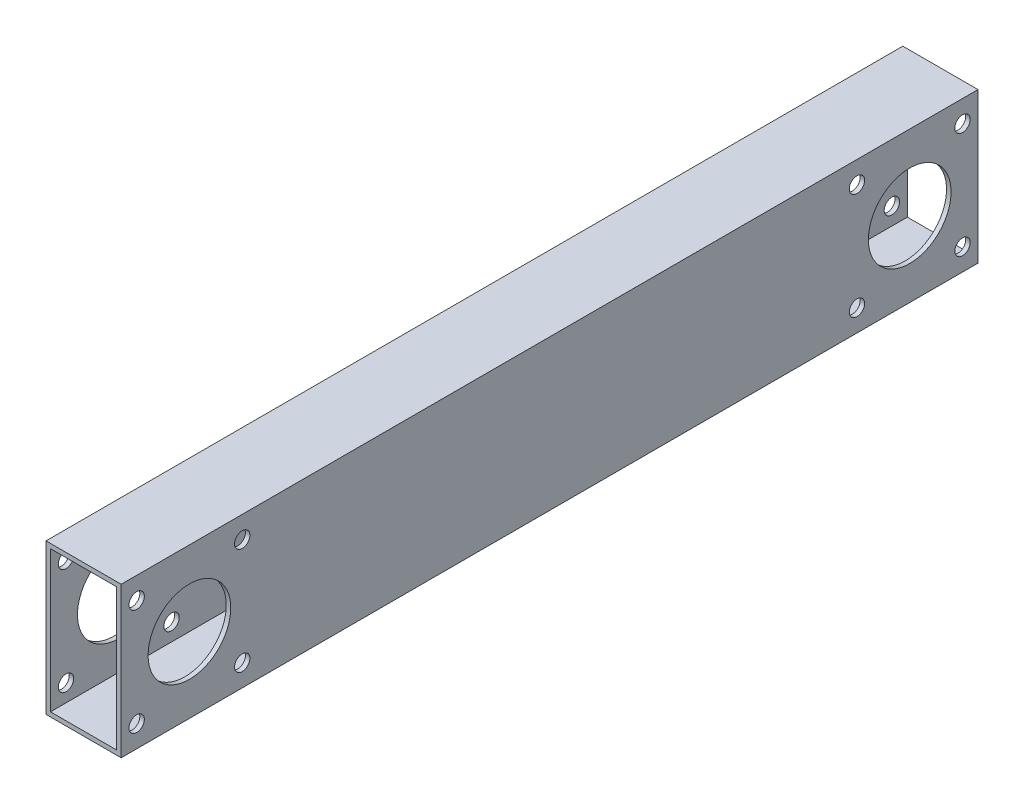
ISO-10303-21;
HEADER;
FILE_DESCRIPTION(('STEP AP214'),'2;1');
FILE_NAME('part.step','',(''),(''),'','','');
FILE_SCHEMA(('AUTOMOTIVE_DESIGN { 1 0 10303 214 1 1 1 1 }'));
ENDSEC;
DATA;
#1=APPLICATION_CONTEXT('core data for automotive mechanical design processes');
#2=APPLICATION_PROTOCOL_DEFINITION('international standard','automotive_design',2000,#1);
#3=PRODUCT_CONTEXT('',#1,'mechanical');
#4=PRODUCT('Part','Part','',(#3));
#5=PRODUCT_RELATED_PRODUCT_CATEGORY('part','',(#4));
#6=PRODUCT_DEFINITION_FORMATION('','',#4);
#7=PRODUCT_DEFINITION_CONTEXT('part definition',#1,'design');
#8=PRODUCT_DEFINITION('design','',#6,#7);
#9=PRODUCT_DEFINITION_SHAPE('','',#8);
#10=(LENGTH_UNIT() NAMED_UNIT(*) SI_UNIT(.MILLI.,.METRE.));
#11=(NAMED_UNIT(*) PLANE_ANGLE_UNIT() SI_UNIT($,.RADIAN.));
#12=(NAMED_UNIT(*) SI_UNIT($,.STERADIAN.) SOLID_ANGLE_UNIT());
#13=UNCERTAINTY_MEASURE_WITH_UNIT(LENGTH_MEASURE(1.E-05),#10,'distance_accuracy_value','');
#14=(GEOMETRIC_REPRESENTATION_CONTEXT(3) GLOBAL_UNCERTAINTY_ASSIGNED_CONTEXT((#13)) GLOBAL_UNIT_ASSIGNED_CONTEXT((#10,
#11,#12)) REPRESENTATION_CONTEXT('',''));
#15=CARTESIAN_POINT('',(0.,0.,0.));
#16=DIRECTION('',(0.,0.,1.));
#17=DIRECTION('',(1.,0.,0.));
#18=AXIS2_PLACEMENT_3D('',#15,#16,#17);
#19=CARTESIAN_POINT('',(0.,100.,570.));
#20=DIRECTION('',(1.,0.,0.));
#21=DIRECTION('',(0.,0.,-1.));
#22=AXIS2_PLACEMENT_3D('',#19,#20,#21);
#23=PLANE('',#22);
#24=CARTESIAN_POINT('',(0.,14.5403167728691,10.2991744768466));
#25=DIRECTION('',(-1.,0.,0.));
#26=DIRECTION('',(0.,0.,1.));
#27=AXIS2_PLACEMENT_3D('',#24,#25,#26);
#28=CIRCLE('',#27,5.1152124263048);
#29=CARTESIAN_POINT('',(0.,14.5403167728691,15.4143869031514));
#30=VERTEX_POINT('',#29);
#31=EDGE_CURVE('E278',#30,#30,#28,.F.);
#32=ORIENTED_EDGE('',*,*,#31,.T.);
#33=EDGE_LOOP('',(#32));
#34=FACE_BOUND('',#33,.T.);
#35=CARTESIAN_POINT('',(0.,85.4596832271309,489.472116890751));
#36=DIRECTION('',(-1.,0.,0.));
#37=DIRECTION('',(0.,0.,1.));
#38=AXIS2_PLACEMENT_3D('',#35,#36,#37);
#39=CIRCLE('',#38,5.1152124263048);
#40=CARTESIAN_POINT('',(0.,85.4596832271309,494.587329317055));
#41=VERTEX_POINT('',#40);
#42=EDGE_CURVE('E282',#41,#41,#39,.T.);
#43=ORIENTED_EDGE('',*,*,#42,.F.);
#44=EDGE_LOOP('',(#43));
#45=FACE_BOUND('',#44,.T.);
#46=CARTESIAN_POINT('',(0.,14.5403167728691,489.472116890751));
#47=DIRECTION('',(-1.,0.,0.));
#48=DIRECTION('',(0.,0.,1.));
#49=AXIS2_PLACEMENT_3D('',#46,#47,#48);
#50=CIRCLE('',#49,5.1152124263048);
#51=CARTESIAN_POINT('',(0.,14.5403167728691,494.587329317055));
#52=VERTEX_POINT('',#51);
#53=EDGE_CURVE('E286',#52,#52,#50,.F.);
#54=ORIENTED_EDGE('',*,*,#53,.T.);
#55=EDGE_LOOP('',(#54));
#56=FACE_BOUND('',#55,.T.);
#57=CARTESIAN_POINT('',(0.,85.4596832271309,10.2991744768466));
#58=DIRECTION('',(-1.,0.,0.));
#59=DIRECTION('',(0.,0.,1.));
#60=AXIS2_PLACEMENT_3D('',#57,#58,#59);
#61=CIRCLE('',#60,5.1152124263048);
#62=CARTESIAN_POINT('',(0.,85.4596832271309,15.4143869031514));
#63=VERTEX_POINT('',#62);
#64=EDGE_CURVE('E290',#63,#63,#61,.T.);
#65=ORIENTED_EDGE('',*,*,#64,.F.);
#66=EDGE_LOOP('',(#65));
#67=FACE_BOUND('',#66,.T.);
#68=CARTESIAN_POINT('',(0.,85.4596832271309,80.5278831092492));
#69=DIRECTION('',(-1.,0.,0.));
#70=DIRECTION('',(0.,0.,1.));
#71=AXIS2_PLACEMENT_3D('',#68,#69,#70);
#72=CIRCLE('',#71,5.1152124263048);
#73=CARTESIAN_POINT('',(0.,85.4596832271309,85.6430955355541));
#74=VERTEX_POINT('',#73);
#75=EDGE_CURVE('E182',#74,#74,#72,.F.);
#76=ORIENTED_EDGE('',*,*,#75,.T.);
#77=EDGE_LOOP('',(#76));
#78=FACE_BOUND('',#77,.T.);
#79=CARTESIAN_POINT('',(0.,50.,45.4135287930479));
#80=DIRECTION('',(-1.,0.,0.));
#81=DIRECTION('',(0.,0.,1.));
#82=AXIS2_PLACEMENT_3D('',#79,#80,#81);
#83=CIRCLE('',#82,27.5);
#84=CARTESIAN_POINT('',(0.,50.,72.9135287930479));
#85=VERTEX_POINT('',#84);
#86=EDGE_CURVE('E172',#85,#85,#83,.T.);
#87=ORIENTED_EDGE('',*,*,#86,.F.);
#88=EDGE_LOOP('',(#87));
#89=FACE_BOUND('',#88,.T.);
#90=CARTESIAN_POINT('',(0.,50.,524.586471206952));
#91=DIRECTION('',(-1.,0.,0.));
#92=DIRECTION('',(0.,0.,-1.));
#93=AXIS2_PLACEMENT_3D('',#90,#91,#92);
#94=CIRCLE('',#93,27.5);
#95=CARTESIAN_POINT('',(0.,50.,497.086471206952));
#96=VERTEX_POINT('',#95);
#97=EDGE_CURVE('E232',#96,#96,#94,.T.);
#98=ORIENTED_EDGE('',*,*,#97,.F.);
#99=EDGE_LOOP('',(#98));
#100=FACE_BOUND('',#99,.T.);
#101=DIRECTION('',(0.,-1.,0.));
#102=VECTOR('',#101,1.);
#103=CARTESIAN_POINT('',(0.,100.,0.));
#104=LINE('',#103,#102);
#105=CARTESIAN_POINT('',(0.,100.,0.));
#106=VERTEX_POINT('',#105);
#107=CARTESIAN_POINT('',(0.,0.,0.));
#108=VERTEX_POINT('',#107);
#109=EDGE_CURVE('E120',#106,#108,#104,.T.);
#110=ORIENTED_EDGE('',*,*,#109,.T.);
#111=DIRECTION('',(0.,0.,-1.));
#112=VECTOR('',#111,1.);
#113=CARTESIAN_POINT('',(0.,0.,570.));
#114=LINE('',#113,#112);
#115=CARTESIAN_POINT('',(0.,0.,570.));
#116=VERTEX_POINT('',#115);
#117=EDGE_CURVE('E11',#116,#108,#114,.T.);
#118=ORIENTED_EDGE('',*,*,#117,.F.);
#119=DIRECTION('',(0.,-1.,0.));
#120=VECTOR('',#119,1.);
#121=CARTESIAN_POINT('',(0.,100.,570.));
#122=LINE('',#121,#120);
#123=CARTESIAN_POINT('',(0.,100.,570.));
#124=VERTEX_POINT('',#123);
#125=EDGE_CURVE('E143',#124,#116,#122,.T.);
#126=ORIENTED_EDGE('',*,*,#125,.F.);
#127=DIRECTION('',(0.,0.,-1.));
#128=VECTOR('',#127,1.);
#129=CARTESIAN_POINT('',(0.,100.,570.));
#130=LINE('',#129,#128);
#131=EDGE_CURVE('E153',#124,#106,#130,.T.);
#132=ORIENTED_EDGE('',*,*,#131,.T.);
#133=EDGE_LOOP('',(#110,#118,#126,#132));
#134=FACE_BOUND('',#133,.T.);
#135=CARTESIAN_POINT('',(0.,14.5403167728691,559.700825523153));
#136=DIRECTION('',(-1.,0.,0.));
#137=DIRECTION('',(0.,0.,1.));
#138=AXIS2_PLACEMENT_3D('',#135,#136,#137);
#139=CIRCLE('',#138,5.11521242630468);
#140=CARTESIAN_POINT('',(0.,14.5403167728691,564.816037949458));
#141=VERTEX_POINT('',#140);
#142=EDGE_CURVE('E304',#141,#141,#139,.T.);
#143=ORIENTED_EDGE('',*,*,#142,.F.);
#144=EDGE_LOOP('',(#143));
#145=FACE_BOUND('',#144,.T.);
#146=CARTESIAN_POINT('',(0.,85.4596832271309,559.700825523153));
#147=DIRECTION('',(-1.,0.,0.));
#148=DIRECTION('',(0.,0.,1.));
#149=AXIS2_PLACEMENT_3D('',#146,#147,#148);
#150=CIRCLE('',#149,5.11521242630468);
#151=CARTESIAN_POINT('',(0.,85.4596832271309,564.816037949458));
#152=VERTEX_POINT('',#151);
#153=EDGE_CURVE('E308',#152,#152,#150,.F.);
#154=ORIENTED_EDGE('',*,*,#153,.T.);
#155=EDGE_LOOP('',(#154));
#156=FACE_BOUND('',#155,.T.);
#157=CARTESIAN_POINT('',(0.,14.5403167728691,80.5278831092492));
#158=DIRECTION('',(-1.,0.,0.));
#159=DIRECTION('',(0.,0.,1.));
#160=AXIS2_PLACEMENT_3D('',#157,#158,#159);
#161=CIRCLE('',#160,5.1152124263048);
#162=CARTESIAN_POINT('',(0.,14.5403167728691,85.6430955355541));
#163=VERTEX_POINT('',#162);
#164=EDGE_CURVE('E311',#163,#163,#161,.T.);
#165=ORIENTED_EDGE('',*,*,#164,.F.);
#166=EDGE_LOOP('',(#165));
#167=FACE_BOUND('',#166,.T.);
#168=ADVANCED_FACE('F37',(#34,#45,#56,#67,#78,#89,#100,#134,#145,#156,#167),#23,.F.);
#169=CARTESIAN_POINT('',(50.,0.,570.));
#170=DIRECTION('',(-1.,0.,0.));
#171=DIRECTION('',(0.,0.,1.));
#172=AXIS2_PLACEMENT_3D('',#169,#170,#171);
#173=PLANE('',#172);
#174=CARTESIAN_POINT('',(50.,14.5403167728691,10.2991744768466));
#175=DIRECTION('',(-1.,0.,0.));
#176=DIRECTION('',(0.,0.,1.));
#177=AXIS2_PLACEMENT_3D('',#174,#175,#176);
#178=CIRCLE('',#177,5.1152124263048);
#179=CARTESIAN_POINT('',(50.,14.5403167728691,15.4143869031514));
#180=VERTEX_POINT('',#179);
#181=EDGE_CURVE('E229',#180,#180,#178,.F.);
#182=ORIENTED_EDGE('',*,*,#181,.F.);
#183=EDGE_LOOP('',(#182));
#184=FACE_BOUND('',#183,.T.);
#185=CARTESIAN_POINT('',(50.,85.4596832271309,489.472116890751));
#186=DIRECTION('',(-1.,0.,0.));
#187=DIRECTION('',(0.,0.,1.));
#188=AXIS2_PLACEMENT_3D('',#185,#186,#187);
#189=CIRCLE('',#188,5.1152124263048);
#190=CARTESIAN_POINT('',(50.,85.4596832271309,494.587329317055));
#191=VERTEX_POINT('',#190);
#192=EDGE_CURVE('E206',#191,#191,#189,.T.);
#193=ORIENTED_EDGE('',*,*,#192,.T.);
#194=EDGE_LOOP('',(#193));
#195=FACE_BOUND('',#194,.T.);
#196=CARTESIAN_POINT('',(50.,14.5403167728691,489.472116890751));
#197=DIRECTION('',(-1.,0.,0.));
#198=DIRECTION('',(0.,0.,1.));
#199=AXIS2_PLACEMENT_3D('',#196,#197,#198);
#200=CIRCLE('',#199,5.1152124263048);
#201=CARTESIAN_POINT('',(50.,14.5403167728691,494.587329317055));
#202=VERTEX_POINT('',#201);
#203=EDGE_CURVE('E202',#202,#202,#200,.F.);
#204=ORIENTED_EDGE('',*,*,#203,.F.);
#205=EDGE_LOOP('',(#204));
#206=FACE_BOUND('',#205,.T.);
#207=CARTESIAN_POINT('',(50.,85.4596832271309,10.2991744768466));
#208=DIRECTION('',(-1.,0.,0.));
#209=DIRECTION('',(0.,0.,1.));
#210=AXIS2_PLACEMENT_3D('',#207,#208,#209);
#211=CIRCLE('',#210,5.1152124263048);
#212=CARTESIAN_POINT('',(50.,85.4596832271309,15.4143869031514));
#213=VERTEX_POINT('',#212);
#214=EDGE_CURVE('E192',#213,#213,#211,.T.);
#215=ORIENTED_EDGE('',*,*,#214,.T.);
#216=EDGE_LOOP('',(#215));
#217=FACE_BOUND('',#216,.T.);
#218=CARTESIAN_POINT('',(50.,85.4596832271309,80.5278831092492));
#219=DIRECTION('',(-1.,0.,0.));
#220=DIRECTION('',(0.,0.,1.));
#221=AXIS2_PLACEMENT_3D('',#218,#219,#220);
#222=CIRCLE('',#221,5.1152124263048);
#223=CARTESIAN_POINT('',(50.,85.4596832271309,85.6430955355541));
#224=VERTEX_POINT('',#223);
#225=EDGE_CURVE('E187',#224,#224,#222,.F.);
#226=ORIENTED_EDGE('',*,*,#225,.F.);
#227=EDGE_LOOP('',(#226));
#228=FACE_BOUND('',#227,.T.);
#229=CARTESIAN_POINT('',(50.,50.,45.4135287930479));
#230=DIRECTION('',(-1.,0.,0.));
#231=DIRECTION('',(0.,0.,1.));
#232=AXIS2_PLACEMENT_3D('',#229,#230,#231);
#233=CIRCLE('',#232,27.5);
#234=CARTESIAN_POINT('',(50.,50.,72.9135287930479));
#235=VERTEX_POINT('',#234);
#236=EDGE_CURVE('E133',#235,#235,#233,.T.);
#237=ORIENTED_EDGE('',*,*,#236,.T.);
#238=EDGE_LOOP('',(#237));
#239=FACE_BOUND('',#238,.T.);
#240=CARTESIAN_POINT('',(50.,50.,524.586471206952));
#241=DIRECTION('',(-1.,0.,0.));
#242=DIRECTION('',(0.,0.,1.));
#243=AXIS2_PLACEMENT_3D('',#240,#241,#242);
#244=CIRCLE('',#243,27.5);
#245=CARTESIAN_POINT('',(50.,50.,552.086471206952));
#246=VERTEX_POINT('',#245);
#247=EDGE_CURVE('E177',#246,#246,#244,.T.);
#248=ORIENTED_EDGE('',*,*,#247,.T.);
#249=EDGE_LOOP('',(#248));
#250=FACE_BOUND('',#249,.T.);
#251=DIRECTION('',(0.,1.,0.));
#252=VECTOR('',#251,1.);
#253=CARTESIAN_POINT('',(50.,0.,0.));
#254=LINE('',#253,#252);
#255=CARTESIAN_POINT('',(50.,0.,0.));
#256=VERTEX_POINT('',#255);
#257=CARTESIAN_POINT('',(50.,100.,0.));
#258=VERTEX_POINT('',#257);
#259=EDGE_CURVE('E158',#256,#258,#254,.T.);
#260=ORIENTED_EDGE('',*,*,#259,.T.);
#261=DIRECTION('',(0.,0.,-1.));
#262=VECTOR('',#261,1.);
#263=CARTESIAN_POINT('',(50.,100.,570.));
#264=LINE('',#263,#262);
#265=CARTESIAN_POINT('',(50.,100.,570.));
#266=VERTEX_POINT('',#265);
#267=EDGE_CURVE('E163',#266,#258,#264,.T.);
#268=ORIENTED_EDGE('',*,*,#267,.F.);
#269=DIRECTION('',(0.,1.,0.));
#270=VECTOR('',#269,1.);
#271=CARTESIAN_POINT('',(50.,0.,570.));
#272=LINE('',#271,#270);
#273=CARTESIAN_POINT('',(50.,0.,570.));
#274=VERTEX_POINT('',#273);
#275=EDGE_CURVE('E149',#274,#266,#272,.T.);
#276=ORIENTED_EDGE('',*,*,#275,.F.);
#277=DIRECTION('',(0.,0.,-1.));
#278=VECTOR('',#277,1.);
#279=CARTESIAN_POINT('',(50.,0.,570.));
#280=LINE('',#279,#278);
#281=EDGE_CURVE('E45',#274,#256,#280,.T.);
#282=ORIENTED_EDGE('',*,*,#281,.T.);
#283=EDGE_LOOP('',(#260,#268,#276,#282));
#284=FACE_BOUND('',#283,.T.);
#285=CARTESIAN_POINT('',(50.,14.5403167728691,559.700825523153));
#286=DIRECTION('',(-1.,0.,0.));
#287=DIRECTION('',(0.,0.,1.));
#288=AXIS2_PLACEMENT_3D('',#285,#286,#287);
#289=CIRCLE('',#288,5.11521242630468);
#290=CARTESIAN_POINT('',(50.,14.5403167728691,564.816037949458));
#291=VERTEX_POINT('',#290);
#292=EDGE_CURVE('E197',#291,#291,#289,.T.);
#293=ORIENTED_EDGE('',*,*,#292,.T.);
#294=EDGE_LOOP('',(#293));
#295=FACE_BOUND('',#294,.T.);
#296=CARTESIAN_POINT('',(50.,85.4596832271309,559.700825523153));
#297=DIRECTION('',(-1.,0.,0.));
#298=DIRECTION('',(0.,0.,1.));
#299=AXIS2_PLACEMENT_3D('',#296,#297,#298);
#300=CIRCLE('',#299,5.11521242630468);
#301=CARTESIAN_POINT('',(50.,85.4596832271309,564.816037949458));
#302=VERTEX_POINT('',#301);
#303=EDGE_CURVE('E210',#302,#302,#300,.F.);
#304=ORIENTED_EDGE('',*,*,#303,.F.);
#305=EDGE_LOOP('',(#304));
#306=FACE_BOUND('',#305,.T.);
#307=CARTESIAN_POINT('',(50.,14.5403167728691,80.5278831092492));
#308=DIRECTION('',(-1.,0.,0.));
#309=DIRECTION('',(0.,0.,1.));
#310=AXIS2_PLACEMENT_3D('',#307,#308,#309);
#311=CIRCLE('',#310,5.1152124263048);
#312=CARTESIAN_POINT('',(50.,14.5403167728691,85.6430955355541));
#313=VERTEX_POINT('',#312);
#314=EDGE_CURVE('E214',#313,#313,#311,.T.);
#315=ORIENTED_EDGE('',*,*,#314,.T.);
#316=EDGE_LOOP('',(#315));
#317=FACE_BOUND('',#316,.T.);
#318=ADVANCED_FACE('F245',(#184,#195,#206,#217,#228,#239,#250,#284,#295,#306,#317),#173,.F.);
#319=CARTESIAN_POINT('',(47.,3.,570.));
#320=DIRECTION('',(-1.,0.,0.));
#321=DIRECTION('',(0.,0.,1.));
#322=AXIS2_PLACEMENT_3D('',#319,#320,#321);
#323=PLANE('',#322);
#324=CARTESIAN_POINT('',(47.,14.5403167728691,10.2991744768466));
#325=DIRECTION('',(-1.,0.,0.));
#326=DIRECTION('',(0.,0.,1.));
#327=AXIS2_PLACEMENT_3D('',#324,#325,#326);
#328=CIRCLE('',#327,5.1152124263048);
#329=CARTESIAN_POINT('',(47.,14.5403167728691,15.4143869031514));
#330=VERTEX_POINT('',#329);
#331=EDGE_CURVE('E226',#330,#330,#328,.F.);
#332=ORIENTED_EDGE('',*,*,#331,.T.);
#333=EDGE_LOOP('',(#332));
#334=FACE_BOUND('',#333,.T.);
#335=CARTESIAN_POINT('',(47.,85.4596832271309,559.700825523153));
#336=DIRECTION('',(-1.,0.,0.));
#337=DIRECTION('',(0.,0.,1.));
#338=AXIS2_PLACEMENT_3D('',#335,#336,#337);
#339=CIRCLE('',#338,5.11521242630468);
#340=CARTESIAN_POINT('',(47.,85.4596832271309,564.816037949458));
#341=VERTEX_POINT('',#340);
#342=EDGE_CURVE('E205',#341,#341,#339,.F.);
#343=ORIENTED_EDGE('',*,*,#342,.T.);
#344=EDGE_LOOP('',(#343));
#345=FACE_BOUND('',#344,.T.);
#346=CARTESIAN_POINT('',(47.,14.5403167728691,489.472116890751));
#347=DIRECTION('',(-1.,0.,0.));
#348=DIRECTION('',(0.,0.,1.));
#349=AXIS2_PLACEMENT_3D('',#346,#347,#348);
#350=CIRCLE('',#349,5.1152124263048);
#351=CARTESIAN_POINT('',(47.,14.5403167728691,494.587329317055));
#352=VERTEX_POINT('',#351);
#353=EDGE_CURVE('E196',#352,#352,#350,.F.);
#354=ORIENTED_EDGE('',*,*,#353,.T.);
#355=EDGE_LOOP('',(#354));
#356=FACE_BOUND('',#355,.T.);
#357=CARTESIAN_POINT('',(47.,85.4596832271309,80.5278831092492));
#358=DIRECTION('',(-1.,0.,0.));
#359=DIRECTION('',(0.,0.,1.));
#360=AXIS2_PLACEMENT_3D('',#357,#358,#359);
#361=CIRCLE('',#360,5.1152124263048);
#362=CARTESIAN_POINT('',(47.,85.4596832271309,85.6430955355541));
#363=VERTEX_POINT('',#362);
#364=EDGE_CURVE('E181',#363,#363,#361,.F.);
#365=ORIENTED_EDGE('',*,*,#364,.T.);
#366=EDGE_LOOP('',(#365));
#367=FACE_BOUND('',#366,.T.);
#368=CARTESIAN_POINT('',(47.,50.,45.4135287930479));
#369=DIRECTION('',(-1.,0.,0.));
#370=DIRECTION('',(0.,0.,1.));
#371=AXIS2_PLACEMENT_3D('',#368,#369,#370);
#372=CIRCLE('',#371,27.5);
#373=CARTESIAN_POINT('',(47.,50.,72.9135287930479));
#374=VERTEX_POINT('',#373);
#375=EDGE_CURVE('E176',#374,#374,#372,.T.);
#376=ORIENTED_EDGE('',*,*,#375,.F.);
#377=EDGE_LOOP('',(#376));
#378=FACE_BOUND('',#377,.T.);
#379=CARTESIAN_POINT('',(47.,50.,524.586471206952));
#380=DIRECTION('',(-1.,0.,0.));
#381=DIRECTION('',(0.,0.,1.));
#382=AXIS2_PLACEMENT_3D('',#379,#380,#381);
#383=CIRCLE('',#382,27.5);
#384=CARTESIAN_POINT('',(47.,50.,552.086471206952));
#385=VERTEX_POINT('',#384);
#386=EDGE_CURVE('E171',#385,#385,#383,.T.);
#387=ORIENTED_EDGE('',*,*,#386,.F.);
#388=EDGE_LOOP('',(#387));
#389=FACE_BOUND('',#388,.T.);
#390=DIRECTION('',(0.,1.,0.));
#391=VECTOR('',#390,1.);
#392=CARTESIAN_POINT('',(47.,3.,0.));
#393=LINE('',#392,#391);
#394=CARTESIAN_POINT('',(47.,3.,0.));
#395=VERTEX_POINT('',#394);
#396=CARTESIAN_POINT('',(47.,97.,0.));
#397=VERTEX_POINT('',#396);
#398=EDGE_CURVE('E61',#395,#397,#393,.T.);
#399=ORIENTED_EDGE('',*,*,#398,.F.);
#400=DIRECTION('',(0.,0.,-1.));
#401=VECTOR('',#400,1.);
#402=CARTESIAN_POINT('',(47.,3.,570.));
#403=LINE('',#402,#401);
#404=CARTESIAN_POINT('',(47.,3.,570.));
#405=VERTEX_POINT('',#404);
#406=EDGE_CURVE('E108',#405,#395,#403,.T.);
#407=ORIENTED_EDGE('',*,*,#406,.F.);
#408=DIRECTION('',(0.,1.,0.));
#409=VECTOR('',#408,1.);
#410=CARTESIAN_POINT('',(47.,3.,570.));
#411=LINE('',#410,#409);
#412=CARTESIAN_POINT('',(47.,97.,570.));
#413=VERTEX_POINT('',#412);
#414=EDGE_CURVE('E103',#405,#413,#411,.T.);
#415=ORIENTED_EDGE('',*,*,#414,.T.);
#416=DIRECTION('',(0.,0.,-1.));
#417=VECTOR('',#416,1.);
#418=CARTESIAN_POINT('',(47.,97.,570.));
#419=LINE('',#418,#417);
#420=EDGE_CURVE('E107',#413,#397,#419,.T.);
#421=ORIENTED_EDGE('',*,*,#420,.T.);
#422=EDGE_LOOP('',(#399,#407,#415,#421));
#423=FACE_BOUND('',#422,.T.);
#424=CARTESIAN_POINT('',(47.,85.4596832271309,10.2991744768466));
#425=DIRECTION('',(-1.,0.,0.));
#426=DIRECTION('',(0.,0.,1.));
#427=AXIS2_PLACEMENT_3D('',#424,#425,#426);
#428=CIRCLE('',#427,5.1152124263048);
#429=CARTESIAN_POINT('',(47.,85.4596832271309,15.4143869031514));
#430=VERTEX_POINT('',#429);
#431=EDGE_CURVE('E186',#430,#430,#428,.T.);
#432=ORIENTED_EDGE('',*,*,#431,.F.);
#433=EDGE_LOOP('',(#432));
#434=FACE_BOUND('',#433,.T.);
#435=CARTESIAN_POINT('',(47.,14.5403167728691,559.700825523153));
#436=DIRECTION('',(-1.,0.,0.));
#437=DIRECTION('',(0.,0.,1.));
#438=AXIS2_PLACEMENT_3D('',#435,#436,#437);
#439=CIRCLE('',#438,5.11521242630468);
#440=CARTESIAN_POINT('',(47.,14.5403167728691,564.816037949458));
#441=VERTEX_POINT('',#440);
#442=EDGE_CURVE('E191',#441,#441,#439,.T.);
#443=ORIENTED_EDGE('',*,*,#442,.F.);
#444=EDGE_LOOP('',(#443));
#445=FACE_BOUND('',#444,.T.);
#446=CARTESIAN_POINT('',(47.,85.4596832271309,489.472116890751));
#447=DIRECTION('',(-1.,0.,0.));
#448=DIRECTION('',(0.,0.,1.));
#449=AXIS2_PLACEMENT_3D('',#446,#447,#448);
#450=CIRCLE('',#449,5.1152124263048);
#451=CARTESIAN_POINT('',(47.,85.4596832271309,494.587329317055));
#452=VERTEX_POINT('',#451);
#453=EDGE_CURVE('E201',#452,#452,#450,.T.);
#454=ORIENTED_EDGE('',*,*,#453,.F.);
#455=EDGE_LOOP('',(#454));
#456=FACE_BOUND('',#455,.T.);
#457=CARTESIAN_POINT('',(47.,14.5403167728691,80.5278831092492));
#458=DIRECTION('',(-1.,0.,0.));
#459=DIRECTION('',(0.,0.,1.));
#460=AXIS2_PLACEMENT_3D('',#457,#458,#459);
#461=CIRCLE('',#460,5.1152124263048);
#462=CARTESIAN_POINT('',(47.,14.5403167728691,85.6430955355541));
#463=VERTEX_POINT('',#462);
#464=EDGE_CURVE('E209',#463,#463,#461,.T.);
#465=ORIENTED_EDGE('',*,*,#464,.F.);
#466=EDGE_LOOP('',(#465));
#467=FACE_BOUND('',#466,.T.);
#468=ADVANCED_FACE('F105',(#334,#345,#356,#367,#378,#389,#423,#434,#445,#456,#467),#323,.T.);
#469=CARTESIAN_POINT('',(3.,97.,570.));
#470=DIRECTION('',(1.,0.,0.));
#471=DIRECTION('',(0.,0.,-1.));
#472=AXIS2_PLACEMENT_3D('',#469,#470,#471);
#473=PLANE('',#472);
#474=CARTESIAN_POINT('',(3.,14.5403167728691,10.2991744768466));
#475=DIRECTION('',(1.,0.,0.));
#476=DIRECTION('',(0.,0.,-1.));
#477=AXIS2_PLACEMENT_3D('',#474,#475,#476);
#478=CIRCLE('',#477,5.1152124263048);
#479=CARTESIAN_POINT('',(3.,14.5403167728691,5.18396205054184));
#480=VERTEX_POINT('',#479);
#481=EDGE_CURVE('E40',#480,#480,#478,.F.);
#482=ORIENTED_EDGE('',*,*,#481,.T.);
#483=EDGE_LOOP('',(#482));
#484=FACE_BOUND('',#483,.T.);
#485=CARTESIAN_POINT('',(3.,85.4596832271309,559.700825523153));
#486=DIRECTION('',(1.,0.,0.));
#487=DIRECTION('',(0.,0.,-1.));
#488=AXIS2_PLACEMENT_3D('',#485,#486,#487);
#489=CIRCLE('',#488,5.11521242630468);
#490=CARTESIAN_POINT('',(3.,85.4596832271309,554.585613096849));
#491=VERTEX_POINT('',#490);
#492=EDGE_CURVE('E203',#491,#491,#489,.F.);
#493=ORIENTED_EDGE('',*,*,#492,.T.);
#494=EDGE_LOOP('',(#493));
#495=FACE_BOUND('',#494,.T.);
#496=CARTESIAN_POINT('',(3.,14.5403167728691,489.472116890751));
#497=DIRECTION('',(1.,0.,0.));
#498=DIRECTION('',(0.,0.,-1.));
#499=AXIS2_PLACEMENT_3D('',#496,#497,#498);
#500=CIRCLE('',#499,5.1152124263048);
#501=CARTESIAN_POINT('',(3.,14.5403167728691,484.356904464446));
#502=VERTEX_POINT('',#501);
#503=EDGE_CURVE('E193',#502,#502,#500,.F.);
#504=ORIENTED_EDGE('',*,*,#503,.T.);
#505=EDGE_LOOP('',(#504));
#506=FACE_BOUND('',#505,.T.);
#507=CARTESIAN_POINT('',(3.,85.4596832271309,80.5278831092492));
#508=DIRECTION('',(1.,0.,0.));
#509=DIRECTION('',(0.,0.,-1.));
#510=AXIS2_PLACEMENT_3D('',#507,#508,#509);
#511=CIRCLE('',#510,5.1152124263048);
#512=CARTESIAN_POINT('',(3.,85.4596832271309,75.4126706829444));
#513=VERTEX_POINT('',#512);
#514=EDGE_CURVE('E178',#513,#513,#511,.F.);
#515=ORIENTED_EDGE('',*,*,#514,.T.);
#516=EDGE_LOOP('',(#515));
#517=FACE_BOUND('',#516,.T.);
#518=CARTESIAN_POINT('',(3.,50.,45.4135287930479));
#519=DIRECTION('',(1.,0.,0.));
#520=DIRECTION('',(0.,0.,-1.));
#521=AXIS2_PLACEMENT_3D('',#518,#519,#520);
#522=CIRCLE('',#521,27.5);
#523=CARTESIAN_POINT('',(3.,50.,17.9135287930479));
#524=VERTEX_POINT('',#523);
#525=EDGE_CURVE('E173',#524,#524,#522,.T.);
#526=ORIENTED_EDGE('',*,*,#525,.F.);
#527=EDGE_LOOP('',(#526));
#528=FACE_BOUND('',#527,.T.);
#529=CARTESIAN_POINT('',(3.,50.,524.586471206952));
#530=DIRECTION('',(1.,0.,0.));
#531=DIRECTION('',(0.,0.,-1.));
#532=AXIS2_PLACEMENT_3D('',#529,#530,#531);
#533=CIRCLE('',#532,27.5);
#534=CARTESIAN_POINT('',(3.,50.,497.086471206952));
#535=VERTEX_POINT('',#534);
#536=EDGE_CURVE('E168',#535,#535,#533,.T.);
#537=ORIENTED_EDGE('',*,*,#536,.F.);
#538=EDGE_LOOP('',(#537));
#539=FACE_BOUND('',#538,.T.);
#540=DIRECTION('',(0.,-1.,0.));
#541=VECTOR('',#540,1.);
#542=CARTESIAN_POINT('',(3.,97.,0.));
#543=LINE('',#542,#541);
#544=CARTESIAN_POINT('',(3.,97.,0.));
#545=VERTEX_POINT('',#544);
#546=CARTESIAN_POINT('',(3.,3.,0.));
#547=VERTEX_POINT('',#546);
#548=EDGE_CURVE('E135',#545,#547,#543,.T.);
#549=ORIENTED_EDGE('',*,*,#548,.F.);
#550=DIRECTION('',(0.,0.,-1.));
#551=VECTOR('',#550,1.);
#552=CARTESIAN_POINT('',(3.,97.,570.));
#553=LINE('',#552,#551);
#554=CARTESIAN_POINT('',(3.,97.,570.));
#555=VERTEX_POINT('',#554);
#556=EDGE_CURVE('E121',#555,#545,#553,.T.);
#557=ORIENTED_EDGE('',*,*,#556,.F.);
#558=DIRECTION('',(0.,-1.,0.));
#559=VECTOR('',#558,1.);
#560=CARTESIAN_POINT('',(3.,97.,570.));
#561=LINE('',#560,#559);
#562=CARTESIAN_POINT('',(3.,3.,570.));
#563=VERTEX_POINT('',#562);
#564=EDGE_CURVE('E125',#555,#563,#561,.T.);
#565=ORIENTED_EDGE('',*,*,#564,.T.);
#566=DIRECTION('',(0.,0.,-1.));
#567=VECTOR('',#566,1.);
#568=CARTESIAN_POINT('',(3.,3.,570.));
#569=LINE('',#568,#567);
#570=EDGE_CURVE('E53',#563,#547,#569,.T.);
#571=ORIENTED_EDGE('',*,*,#570,.T.);
#572=EDGE_LOOP('',(#549,#557,#565,#571));
#573=FACE_BOUND('',#572,.T.);
#574=CARTESIAN_POINT('',(3.,85.4596832271309,10.2991744768466));
#575=DIRECTION('',(1.,0.,0.));
#576=DIRECTION('',(0.,0.,-1.));
#577=AXIS2_PLACEMENT_3D('',#574,#575,#576);
#578=CIRCLE('',#577,5.1152124263048);
#579=CARTESIAN_POINT('',(3.,85.4596832271309,5.18396205054184));
#580=VERTEX_POINT('',#579);
#581=EDGE_CURVE('E183',#580,#580,#578,.T.);
#582=ORIENTED_EDGE('',*,*,#581,.F.);
#583=EDGE_LOOP('',(#582));
#584=FACE_BOUND('',#583,.T.);
#585=CARTESIAN_POINT('',(3.,14.5403167728691,559.700825523153));
#586=DIRECTION('',(1.,0.,0.));
#587=DIRECTION('',(0.,0.,-1.));
#588=AXIS2_PLACEMENT_3D('',#585,#586,#587);
#589=CIRCLE('',#588,5.11521242630468);
#590=CARTESIAN_POINT('',(3.,14.5403167728691,554.585613096849));
#591=VERTEX_POINT('',#590);
#592=EDGE_CURVE('E188',#591,#591,#589,.T.);
#593=ORIENTED_EDGE('',*,*,#592,.F.);
#594=EDGE_LOOP('',(#593));
#595=FACE_BOUND('',#594,.T.);
#596=CARTESIAN_POINT('',(3.,85.4596832271309,489.472116890751));
#597=DIRECTION('',(1.,0.,0.));
#598=DIRECTION('',(0.,0.,-1.));
#599=AXIS2_PLACEMENT_3D('',#596,#597,#598);
#600=CIRCLE('',#599,5.1152124263048);
#601=CARTESIAN_POINT('',(3.,85.4596832271309,484.356904464446));
#602=VERTEX_POINT('',#601);
#603=EDGE_CURVE('E198',#602,#602,#600,.T.);
#604=ORIENTED_EDGE('',*,*,#603,.F.);
#605=EDGE_LOOP('',(#604));
#606=FACE_BOUND('',#605,.T.);
#607=CARTESIAN_POINT('',(3.,14.5403167728691,80.5278831092492));
#608=DIRECTION('',(1.,0.,0.));
#609=DIRECTION('',(0.,0.,-1.));
#610=AXIS2_PLACEMENT_3D('',#607,#608,#609);
#611=CIRCLE('',#610,5.1152124263048);
#612=CARTESIAN_POINT('',(3.,14.5403167728691,75.4126706829444));
#613=VERTEX_POINT('',#612);
#614=EDGE_CURVE('E207',#613,#613,#611,.T.);
#615=ORIENTED_EDGE('',*,*,#614,.F.);
#616=EDGE_LOOP('',(#615));
#617=FACE_BOUND('',#616,.T.);
#618=ADVANCED_FACE('F374',(#484,#495,#506,#517,#528,#539,#573,#584,#595,#606,#617),#473,.T.);
#619=CARTESIAN_POINT('',(0.,0.,570.));
#620=DIRECTION('',(0.,0.,1.));
#621=DIRECTION('',(1.,0.,0.));
#622=AXIS2_PLACEMENT_3D('',#619,#620,#621);
#623=PLANE('',#622);
#624=ORIENTED_EDGE('',*,*,#125,.T.);
#625=DIRECTION('',(1.,0.,0.));
#626=VECTOR('',#625,1.);
#627=CARTESIAN_POINT('',(0.,0.,570.));
#628=LINE('',#627,#626);
#629=EDGE_CURVE('E146',#116,#274,#628,.T.);
#630=ORIENTED_EDGE('',*,*,#629,.T.);
#631=ORIENTED_EDGE('',*,*,#275,.T.);
#632=DIRECTION('',(-1.,0.,0.));
#633=VECTOR('',#632,1.);
#634=CARTESIAN_POINT('',(50.,100.,570.));
#635=LINE('',#634,#633);
#636=EDGE_CURVE('E151',#266,#124,#635,.T.);
#637=ORIENTED_EDGE('',*,*,#636,.T.);
#638=EDGE_LOOP('',(#624,#630,#631,#637));
#639=FACE_BOUND('',#638,.T.);
#640=DIRECTION('',(-1.,0.,0.));
#641=VECTOR('',#640,1.);
#642=CARTESIAN_POINT('',(47.,97.,570.));
#643=LINE('',#642,#641);
#644=EDGE_CURVE('E112',#413,#555,#643,.T.);
#645=ORIENTED_EDGE('',*,*,#644,.F.);
#646=ORIENTED_EDGE('',*,*,#414,.F.);
#647=DIRECTION('',(1.,0.,0.));
#648=VECTOR('',#647,1.);
#649=CARTESIAN_POINT('',(3.,3.,570.));
#650=LINE('',#649,#648);
#651=EDGE_CURVE('E127',#563,#405,#650,.T.);
#652=ORIENTED_EDGE('',*,*,#651,.F.);
#653=ORIENTED_EDGE('',*,*,#564,.F.);
#654=EDGE_LOOP('',(#645,#646,#652,#653));
#655=FACE_BOUND('',#654,.T.);
#656=ADVANCED_FACE('F124',(#639,#655),#623,.T.);
#657=CARTESIAN_POINT('',(0.,0.,0.));
#658=DIRECTION('',(0.,0.,1.));
#659=DIRECTION('',(1.,0.,0.));
#660=AXIS2_PLACEMENT_3D('',#657,#658,#659);
#661=PLANE('',#660);
#662=ORIENTED_EDGE('',*,*,#109,.F.);
#663=DIRECTION('',(-1.,0.,0.));
#664=VECTOR('',#663,1.);
#665=CARTESIAN_POINT('',(50.,100.,0.));
#666=LINE('',#665,#664);
#667=EDGE_CURVE('E147',#258,#106,#666,.T.);
#668=ORIENTED_EDGE('',*,*,#667,.F.);
#669=ORIENTED_EDGE('',*,*,#259,.F.);
#670=DIRECTION('',(1.,0.,0.));
#671=VECTOR('',#670,1.);
#672=CARTESIAN_POINT('',(0.,0.,0.));
#673=LINE('',#672,#671);
#674=EDGE_CURVE('E156',#108,#256,#673,.T.);
#675=ORIENTED_EDGE('',*,*,#674,.F.);
#676=EDGE_LOOP('',(#662,#668,#669,#675));
#677=FACE_BOUND('',#676,.T.);
#678=ORIENTED_EDGE('',*,*,#398,.T.);
#679=DIRECTION('',(-1.,0.,0.));
#680=VECTOR('',#679,1.);
#681=CARTESIAN_POINT('',(47.,97.,0.));
#682=LINE('',#681,#680);
#683=EDGE_CURVE('E119',#397,#545,#682,.T.);
#684=ORIENTED_EDGE('',*,*,#683,.T.);
#685=ORIENTED_EDGE('',*,*,#548,.T.);
#686=DIRECTION('',(1.,0.,0.));
#687=VECTOR('',#686,1.);
#688=CARTESIAN_POINT('',(3.,3.,0.));
#689=LINE('',#688,#687);
#690=EDGE_CURVE('E113',#547,#395,#689,.T.);
#691=ORIENTED_EDGE('',*,*,#690,.T.);
#692=EDGE_LOOP('',(#678,#684,#685,#691));
#693=FACE_BOUND('',#692,.T.);
#694=ADVANCED_FACE('F383',(#677,#693),#661,.F.);
#695=CARTESIAN_POINT('',(0.,0.,570.));
#696=DIRECTION('',(0.,1.,0.));
#697=DIRECTION('',(0.,0.,1.));
#698=AXIS2_PLACEMENT_3D('',#695,#696,#697);
#699=PLANE('',#698);
#700=ORIENTED_EDGE('',*,*,#674,.T.);
#701=ORIENTED_EDGE('',*,*,#281,.F.);
#702=ORIENTED_EDGE('',*,*,#629,.F.);
#703=ORIENTED_EDGE('',*,*,#117,.T.);
#704=EDGE_LOOP('',(#700,#701,#702,#703));
#705=FACE_BOUND('',#704,.T.);
#706=ADVANCED_FACE('F398',(#705),#699,.F.);
#707=CARTESIAN_POINT('',(50.,100.,570.));
#708=DIRECTION('',(0.,-1.,0.));
#709=DIRECTION('',(1.,0.,0.));
#710=AXIS2_PLACEMENT_3D('',#707,#708,#709);
#711=PLANE('',#710);
#712=ORIENTED_EDGE('',*,*,#667,.T.);
#713=ORIENTED_EDGE('',*,*,#131,.F.);
#714=ORIENTED_EDGE('',*,*,#636,.F.);
#715=ORIENTED_EDGE('',*,*,#267,.T.);
#716=EDGE_LOOP('',(#712,#713,#714,#715));
#717=FACE_BOUND('',#716,.T.);
#718=ADVANCED_FACE('F394',(#717),#711,.F.);
#719=CARTESIAN_POINT('',(47.,97.,570.));
#720=DIRECTION('',(0.,-1.,0.));
#721=DIRECTION('',(0.,0.,-1.));
#722=AXIS2_PLACEMENT_3D('',#719,#720,#721);
#723=PLANE('',#722);
#724=ORIENTED_EDGE('',*,*,#683,.F.);
#725=ORIENTED_EDGE('',*,*,#420,.F.);
#726=ORIENTED_EDGE('',*,*,#644,.T.);
#727=ORIENTED_EDGE('',*,*,#556,.T.);
#728=EDGE_LOOP('',(#724,#725,#726,#727));
#729=FACE_BOUND('',#728,.T.);
#730=ADVANCED_FACE('F116',(#729),#723,.T.);
#731=CARTESIAN_POINT('',(3.,3.,570.));
#732=DIRECTION('',(0.,1.,0.));
#733=DIRECTION('',(0.,0.,1.));
#734=AXIS2_PLACEMENT_3D('',#731,#732,#733);
#735=PLANE('',#734);
#736=ORIENTED_EDGE('',*,*,#690,.F.);
#737=ORIENTED_EDGE('',*,*,#570,.F.);
#738=ORIENTED_EDGE('',*,*,#651,.T.);
#739=ORIENTED_EDGE('',*,*,#406,.T.);
#740=EDGE_LOOP('',(#736,#737,#738,#739));
#741=FACE_BOUND('',#740,.T.);
#742=ADVANCED_FACE('F392',(#741),#735,.T.);
#743=CARTESIAN_POINT('',(570.,50.,524.586471206952));
#744=DIRECTION('',(-1.,0.,0.));
#745=DIRECTION('',(0.,0.,1.));
#746=AXIS2_PLACEMENT_3D('',#743,#744,#745);
#747=CYLINDRICAL_SURFACE('',#746,27.5);
#748=ORIENTED_EDGE('',*,*,#536,.T.);
#749=EDGE_LOOP('',(#748));
#750=FACE_BOUND('',#749,.T.);
#751=ORIENTED_EDGE('',*,*,#97,.T.);
#752=EDGE_LOOP('',(#751));
#753=FACE_BOUND('',#752,.T.);
#754=ADVANCED_FACE('F265',(#750,#753),#747,.F.);
#755=CARTESIAN_POINT('',(570.,50.,45.4135287930479));
#756=DIRECTION('',(-1.,0.,0.));
#757=DIRECTION('',(0.,0.,1.));
#758=AXIS2_PLACEMENT_3D('',#755,#756,#757);
#759=CYLINDRICAL_SURFACE('',#758,27.5);
#760=ORIENTED_EDGE('',*,*,#525,.T.);
#761=EDGE_LOOP('',(#760));
#762=FACE_BOUND('',#761,.T.);
#763=ORIENTED_EDGE('',*,*,#86,.T.);
#764=EDGE_LOOP('',(#763));
#765=FACE_BOUND('',#764,.T.);
#766=ADVANCED_FACE('F254',(#762,#765),#759,.F.);
#767=ORIENTED_EDGE('',*,*,#386,.T.);
#768=EDGE_LOOP('',(#767));
#769=FACE_BOUND('',#768,.T.);
#770=ORIENTED_EDGE('',*,*,#247,.F.);
#771=EDGE_LOOP('',(#770));
#772=FACE_BOUND('',#771,.T.);
#773=ADVANCED_FACE('F251',(#769,#772),#747,.F.);
#774=ORIENTED_EDGE('',*,*,#375,.T.);
#775=EDGE_LOOP('',(#774));
#776=FACE_BOUND('',#775,.T.);
#777=ORIENTED_EDGE('',*,*,#236,.F.);
#778=EDGE_LOOP('',(#777));
#779=FACE_BOUND('',#778,.T.);
#780=ADVANCED_FACE('F248',(#776,#779),#759,.F.);
#781=CARTESIAN_POINT('',(570.,85.4596832271309,80.5278831092492));
#782=DIRECTION('',(-1.,0.,0.));
#783=DIRECTION('',(0.,0.,1.));
#784=AXIS2_PLACEMENT_3D('',#781,#782,#783);
#785=CYLINDRICAL_SURFACE('',#784,5.1152124263048);
#786=ORIENTED_EDGE('',*,*,#514,.F.);
#787=EDGE_LOOP('',(#786));
#788=FACE_BOUND('',#787,.T.);
#789=ORIENTED_EDGE('',*,*,#75,.F.);
#790=EDGE_LOOP('',(#789));
#791=FACE_BOUND('',#790,.T.);
#792=ADVANCED_FACE('F250',(#788,#791),#785,.F.);
#793=CARTESIAN_POINT('',(570.,85.4596832271309,10.2991744768466));
#794=DIRECTION('',(-1.,0.,0.));
#795=DIRECTION('',(0.,0.,1.));
#796=AXIS2_PLACEMENT_3D('',#793,#794,#795);
#797=CYLINDRICAL_SURFACE('',#796,5.1152124263048);
#798=ORIENTED_EDGE('',*,*,#581,.T.);
#799=EDGE_LOOP('',(#798));
#800=FACE_BOUND('',#799,.T.);
#801=ORIENTED_EDGE('',*,*,#64,.T.);
#802=EDGE_LOOP('',(#801));
#803=FACE_BOUND('',#802,.T.);
#804=ADVANCED_FACE('F259',(#800,#803),#797,.F.);
#805=CARTESIAN_POINT('',(570.,14.5403167728691,559.700825523153));
#806=DIRECTION('',(-1.,0.,0.));
#807=DIRECTION('',(0.,0.,1.));
#808=AXIS2_PLACEMENT_3D('',#805,#806,#807);
#809=CYLINDRICAL_SURFACE('',#808,5.11521242630468);
#810=ORIENTED_EDGE('',*,*,#592,.T.);
#811=EDGE_LOOP('',(#810));
#812=FACE_BOUND('',#811,.T.);
#813=ORIENTED_EDGE('',*,*,#142,.T.);
#814=EDGE_LOOP('',(#813));
#815=FACE_BOUND('',#814,.T.);
#816=ADVANCED_FACE('F369',(#812,#815),#809,.F.);
#817=CARTESIAN_POINT('',(570.,14.5403167728691,489.472116890751));
#818=DIRECTION('',(-1.,0.,0.));
#819=DIRECTION('',(0.,0.,1.));
#820=AXIS2_PLACEMENT_3D('',#817,#818,#819);
#821=CYLINDRICAL_SURFACE('',#820,5.1152124263048);
#822=ORIENTED_EDGE('',*,*,#503,.F.);
#823=EDGE_LOOP('',(#822));
#824=FACE_BOUND('',#823,.T.);
#825=ORIENTED_EDGE('',*,*,#53,.F.);
#826=EDGE_LOOP('',(#825));
#827=FACE_BOUND('',#826,.T.);
#828=ADVANCED_FACE('F360',(#824,#827),#821,.F.);
#829=CARTESIAN_POINT('',(570.,85.4596832271309,489.472116890751));
#830=DIRECTION('',(-1.,0.,0.));
#831=DIRECTION('',(0.,0.,1.));
#832=AXIS2_PLACEMENT_3D('',#829,#830,#831);
#833=CYLINDRICAL_SURFACE('',#832,5.1152124263048);
#834=ORIENTED_EDGE('',*,*,#603,.T.);
#835=EDGE_LOOP('',(#834));
#836=FACE_BOUND('',#835,.T.);
#837=ORIENTED_EDGE('',*,*,#42,.T.);
#838=EDGE_LOOP('',(#837));
#839=FACE_BOUND('',#838,.T.);
#840=ADVANCED_FACE('F348',(#836,#839),#833,.F.);
#841=CARTESIAN_POINT('',(570.,85.4596832271309,559.700825523153));
#842=DIRECTION('',(-1.,0.,0.));
#843=DIRECTION('',(0.,0.,1.));
#844=AXIS2_PLACEMENT_3D('',#841,#842,#843);
#845=CYLINDRICAL_SURFACE('',#844,5.11521242630468);
#846=ORIENTED_EDGE('',*,*,#492,.F.);
#847=EDGE_LOOP('',(#846));
#848=FACE_BOUND('',#847,.T.);
#849=ORIENTED_EDGE('',*,*,#153,.F.);
#850=EDGE_LOOP('',(#849));
#851=FACE_BOUND('',#850,.T.);
#852=ADVANCED_FACE('F356',(#848,#851),#845,.F.);
#853=CARTESIAN_POINT('',(570.,14.5403167728691,80.5278831092492));
#854=DIRECTION('',(-1.,0.,0.));
#855=DIRECTION('',(0.,0.,1.));
#856=AXIS2_PLACEMENT_3D('',#853,#854,#855);
#857=CYLINDRICAL_SURFACE('',#856,5.1152124263048);
#858=ORIENTED_EDGE('',*,*,#614,.T.);
#859=EDGE_LOOP('',(#858));
#860=FACE_BOUND('',#859,.T.);
#861=ORIENTED_EDGE('',*,*,#164,.T.);
#862=EDGE_LOOP('',(#861));
#863=FACE_BOUND('',#862,.T.);
#864=ADVANCED_FACE('F367',(#860,#863),#857,.F.);
#865=CARTESIAN_POINT('',(570.,14.5403167728691,10.2991744768466));
#866=DIRECTION('',(-1.,0.,0.));
#867=DIRECTION('',(0.,0.,1.));
#868=AXIS2_PLACEMENT_3D('',#865,#866,#867);
#869=CYLINDRICAL_SURFACE('',#868,5.1152124263048);
#870=ORIENTED_EDGE('',*,*,#481,.F.);
#871=EDGE_LOOP('',(#870));
#872=FACE_BOUND('',#871,.T.);
#873=ORIENTED_EDGE('',*,*,#31,.F.);
#874=EDGE_LOOP('',(#873));
#875=FACE_BOUND('',#874,.T.);
#876=ADVANCED_FACE('F454',(#872,#875),#869,.F.);
#877=ORIENTED_EDGE('',*,*,#364,.F.);
#878=EDGE_LOOP('',(#877));
#879=FACE_BOUND('',#878,.T.);
#880=ORIENTED_EDGE('',*,*,#225,.T.);
#881=EDGE_LOOP('',(#880));
#882=FACE_BOUND('',#881,.T.);
#883=ADVANCED_FACE('F262',(#879,#882),#785,.F.);
#884=ORIENTED_EDGE('',*,*,#431,.T.);
#885=EDGE_LOOP('',(#884));
#886=FACE_BOUND('',#885,.T.);
#887=ORIENTED_EDGE('',*,*,#214,.F.);
#888=EDGE_LOOP('',(#887));
#889=FACE_BOUND('',#888,.T.);
#890=ADVANCED_FACE('F443',(#886,#889),#797,.F.);
#891=ORIENTED_EDGE('',*,*,#442,.T.);
#892=EDGE_LOOP('',(#891));
#893=FACE_BOUND('',#892,.T.);
#894=ORIENTED_EDGE('',*,*,#292,.F.);
#895=EDGE_LOOP('',(#894));
#896=FACE_BOUND('',#895,.T.);
#897=ADVANCED_FACE('F357',(#893,#896),#809,.F.);
#898=ORIENTED_EDGE('',*,*,#353,.F.);
#899=EDGE_LOOP('',(#898));
#900=FACE_BOUND('',#899,.T.);
#901=ORIENTED_EDGE('',*,*,#203,.T.);
#902=EDGE_LOOP('',(#901));
#903=FACE_BOUND('',#902,.T.);
#904=ADVANCED_FACE('F345',(#900,#903),#821,.F.);
#905=ORIENTED_EDGE('',*,*,#453,.T.);
#906=EDGE_LOOP('',(#905));
#907=FACE_BOUND('',#906,.T.);
#908=ORIENTED_EDGE('',*,*,#192,.F.);
#909=EDGE_LOOP('',(#908));
#910=FACE_BOUND('',#909,.T.);
#911=ADVANCED_FACE('F342',(#907,#910),#833,.F.);
#912=ORIENTED_EDGE('',*,*,#342,.F.);
#913=EDGE_LOOP('',(#912));
#914=FACE_BOUND('',#913,.T.);
#915=ORIENTED_EDGE('',*,*,#303,.T.);
#916=EDGE_LOOP('',(#915));
#917=FACE_BOUND('',#916,.T.);
#918=ADVANCED_FACE('F344',(#914,#917),#845,.F.);
#919=ORIENTED_EDGE('',*,*,#464,.T.);
#920=EDGE_LOOP('',(#919));
#921=FACE_BOUND('',#920,.T.);
#922=ORIENTED_EDGE('',*,*,#314,.F.);
#923=EDGE_LOOP('',(#922));
#924=FACE_BOUND('',#923,.T.);
#925=ADVANCED_FACE('F353',(#921,#924),#857,.F.);
#926=ORIENTED_EDGE('',*,*,#331,.F.);
#927=EDGE_LOOP('',(#926));
#928=FACE_BOUND('',#927,.T.);
#929=ORIENTED_EDGE('',*,*,#181,.T.);
#930=EDGE_LOOP('',(#929));
#931=FACE_BOUND('',#930,.T.);
#932=ADVANCED_FACE('F472',(#928,#931),#869,.F.);
#933=CLOSED_SHELL('',(#168,#318,#468,#618,#656,#694,#706,#718,#730,#742,#754,#766,#773,#780,
#792,#804,#816,#828,#840,#852,#864,#876,#883,#890,#897,#904,#911,#918,#925,#932));
#934=MANIFOLD_SOLID_BREP('B2',#933);
#935=ADVANCED_BREP_SHAPE_REPRESENTATION('',(#18,#934),#14);
#936=SHAPE_DEFINITION_REPRESENTATION(#9,#935);
ENDSEC;
END-ISO-10303-21;
